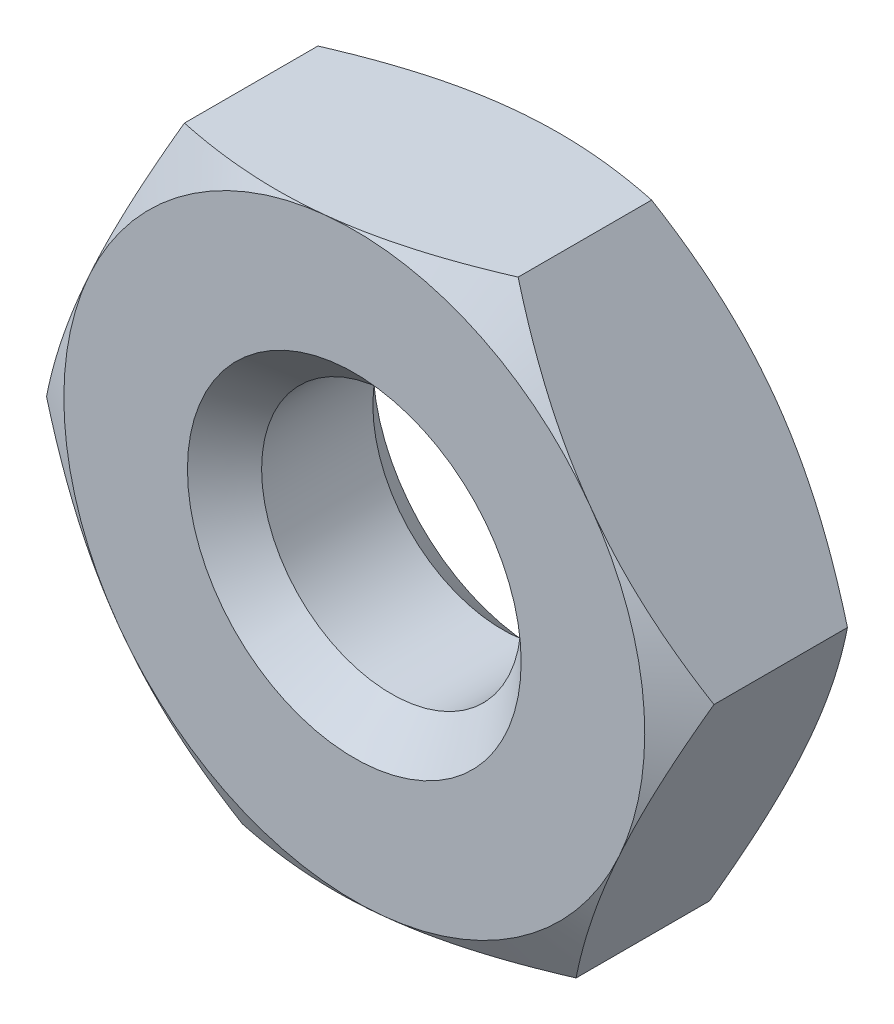
ISO-10303-21;
HEADER;
FILE_DESCRIPTION(('STEP AP214'),'2;1');
FILE_NAME('part.step','',(''),(''),'','','');
FILE_SCHEMA(('AUTOMOTIVE_DESIGN { 1 0 10303 214 1 1 1 1 }'));
ENDSEC;
DATA;
#1=APPLICATION_CONTEXT('core data for automotive mechanical design processes');
#2=APPLICATION_PROTOCOL_DEFINITION('international standard','automotive_design',2000,#1);
#3=PRODUCT_CONTEXT('',#1,'mechanical');
#4=PRODUCT('Part','Part','',(#3));
#5=PRODUCT_RELATED_PRODUCT_CATEGORY('part','',(#4));
#6=PRODUCT_DEFINITION_FORMATION('','',#4);
#7=PRODUCT_DEFINITION_CONTEXT('part definition',#1,'design');
#8=PRODUCT_DEFINITION('design','',#6,#7);
#9=PRODUCT_DEFINITION_SHAPE('','',#8);
#10=(LENGTH_UNIT() NAMED_UNIT(*) SI_UNIT(.MILLI.,.METRE.));
#11=(NAMED_UNIT(*) PLANE_ANGLE_UNIT() SI_UNIT($,.RADIAN.));
#12=(NAMED_UNIT(*) SI_UNIT($,.STERADIAN.) SOLID_ANGLE_UNIT());
#13=UNCERTAINTY_MEASURE_WITH_UNIT(LENGTH_MEASURE(1.E-05),#10,'distance_accuracy_value','');
#14=(GEOMETRIC_REPRESENTATION_CONTEXT(3) GLOBAL_UNCERTAINTY_ASSIGNED_CONTEXT((#13)) GLOBAL_UNIT_ASSIGNED_CONTEXT((#10,
#11,#12)) REPRESENTATION_CONTEXT('',''));
#15=CARTESIAN_POINT('',(0.,0.,0.));
#16=DIRECTION('',(0.,0.,1.));
#17=DIRECTION('',(1.,0.,0.));
#18=AXIS2_PLACEMENT_3D('',#15,#16,#17);
#19=CARTESIAN_POINT('',(0.,0.,1.5));
#20=DIRECTION('',(0.,0.,1.));
#21=DIRECTION('',(1.,0.,0.));
#22=AXIS2_PLACEMENT_3D('',#19,#20,#21);
#23=PLANE('',#22);
#24=CARTESIAN_POINT('',(0.,0.,1.5));
#25=DIRECTION('',(0.,0.,1.));
#26=DIRECTION('',(1.,0.,0.));
#27=AXIS2_PLACEMENT_3D('',#24,#25,#26);
#28=CIRCLE('',#27,1.35);
#29=CARTESIAN_POINT('',(1.35,0.,1.5));
#30=VERTEX_POINT('',#29);
#31=EDGE_CURVE('E11',#30,#30,#28,.F.);
#32=ORIENTED_EDGE('',*,*,#31,.T.);
#33=EDGE_LOOP('',(#32));
#34=FACE_BOUND('',#33,.T.);
#35=CARTESIAN_POINT('',(0.,0.,1.5));
#36=DIRECTION('',(0.,0.,-1.));
#37=DIRECTION('',(-1.,0.,0.));
#38=AXIS2_PLACEMENT_3D('',#35,#36,#37);
#39=CIRCLE('',#38,2.35);
#40=CARTESIAN_POINT('',(2.14226039399558,-0.966033334993097,1.5));
#41=VERTEX_POINT('',#40);
#42=CARTESIAN_POINT('',(0.234520787991168,-2.33826859021798,1.5));
#43=VERTEX_POINT('',#42);
#44=EDGE_CURVE('E306',#41,#43,#39,.T.);
#45=ORIENTED_EDGE('',*,*,#44,.F.);
#46=CARTESIAN_POINT('',(1.90773960600442,1.37223525522489,1.5));
#47=VERTEX_POINT('',#46);
#48=EDGE_CURVE('E308',#47,#41,#39,.T.);
#49=ORIENTED_EDGE('',*,*,#48,.F.);
#50=CARTESIAN_POINT('',(-0.234520787991167,2.33826859021799,1.5));
#51=VERTEX_POINT('',#50);
#52=EDGE_CURVE('E312',#51,#47,#39,.T.);
#53=ORIENTED_EDGE('',*,*,#52,.F.);
#54=CARTESIAN_POINT('',(-2.14226039399558,0.966033334993073,1.5));
#55=VERTEX_POINT('',#54);
#56=EDGE_CURVE('E314',#55,#51,#39,.T.);
#57=ORIENTED_EDGE('',*,*,#56,.F.);
#58=CARTESIAN_POINT('',(-1.90773960600441,-1.37223525522491,1.5));
#59=VERTEX_POINT('',#58);
#60=EDGE_CURVE('E313',#59,#55,#39,.T.);
#61=ORIENTED_EDGE('',*,*,#60,.F.);
#62=EDGE_CURVE('E310',#43,#59,#39,.T.);
#63=ORIENTED_EDGE('',*,*,#62,.F.);
#64=EDGE_LOOP('',(#45,#49,#53,#57,#61,#63));
#65=FACE_BOUND('',#64,.T.);
#66=ADVANCED_FACE('F35',(#34,#65),#23,.T.);
#67=CARTESIAN_POINT('',(0.,0.,0.));
#68=DIRECTION('',(0.,0.,1.));
#69=DIRECTION('',(1.,0.,0.));
#70=AXIS2_PLACEMENT_3D('',#67,#68,#69);
#71=PLANE('',#70);
#72=CARTESIAN_POINT('',(0.,0.,0.));
#73=DIRECTION('',(0.,0.,1.));
#74=DIRECTION('',(1.,0.,0.));
#75=AXIS2_PLACEMENT_3D('',#72,#73,#74);
#76=CIRCLE('',#75,1.35);
#77=CARTESIAN_POINT('',(1.35,0.,0.));
#78=VERTEX_POINT('',#77);
#79=EDGE_CURVE('E291',#78,#78,#76,.T.);
#80=ORIENTED_EDGE('',*,*,#79,.T.);
#81=EDGE_LOOP('',(#80));
#82=FACE_BOUND('',#81,.T.);
#83=CARTESIAN_POINT('',(0.,0.,0.));
#84=DIRECTION('',(0.,0.,-1.));
#85=DIRECTION('',(-1.,0.,0.));
#86=AXIS2_PLACEMENT_3D('',#83,#84,#85);
#87=CIRCLE('',#86,2.35);
#88=CARTESIAN_POINT('',(1.90773960600442,1.37223525522489,0.));
#89=VERTEX_POINT('',#88);
#90=CARTESIAN_POINT('',(2.14226039399558,-0.966033334993096,0.));
#91=VERTEX_POINT('',#90);
#92=EDGE_CURVE('E50',#89,#91,#87,.T.);
#93=ORIENTED_EDGE('',*,*,#92,.T.);
#94=CARTESIAN_POINT('',(0.234520787991168,-2.33826859021798,0.));
#95=VERTEX_POINT('',#94);
#96=EDGE_CURVE('E160',#91,#95,#87,.T.);
#97=ORIENTED_EDGE('',*,*,#96,.T.);
#98=CARTESIAN_POINT('',(-1.90773960600441,-1.37223525522491,0.));
#99=VERTEX_POINT('',#98);
#100=EDGE_CURVE('E159',#95,#99,#87,.T.);
#101=ORIENTED_EDGE('',*,*,#100,.T.);
#102=CARTESIAN_POINT('',(-2.14226039399558,0.966033334993073,0.));
#103=VERTEX_POINT('',#102);
#104=EDGE_CURVE('E139',#99,#103,#87,.T.);
#105=ORIENTED_EDGE('',*,*,#104,.T.);
#106=CARTESIAN_POINT('',(-0.234520787991167,2.33826859021799,0.));
#107=VERTEX_POINT('',#106);
#108=EDGE_CURVE('E125',#103,#107,#87,.T.);
#109=ORIENTED_EDGE('',*,*,#108,.T.);
#110=EDGE_CURVE('E137',#107,#89,#87,.T.);
#111=ORIENTED_EDGE('',*,*,#110,.T.);
#112=EDGE_LOOP('',(#93,#97,#101,#105,#109,#111));
#113=FACE_BOUND('',#112,.T.);
#114=ADVANCED_FACE('F157',(#82,#113),#71,.F.);
#115=CARTESIAN_POINT('',(2.7,0.270801280154528,1.5));
#116=DIRECTION('',(-0.811804087661454,-0.583929895840378,0.));
#117=DIRECTION('',(0.583929895840378,-0.811804087661454,0.));
#118=AXIS2_PLACEMENT_3D('',#115,#116,#117);
#119=PLANE('',#118);
#120=DIRECTION('',(0.,0.,-1.));
#121=VECTOR('',#120,1.);
#122=CARTESIAN_POINT('',(2.7,0.270801280154528,1.5));
#123=LINE('',#122,#121);
#124=CARTESIAN_POINT('',(2.7,0.270801280154528,1.29010646592895));
#125=VERTEX_POINT('',#124);
#126=CARTESIAN_POINT('',(2.7,0.270801280154528,0.209893534071046));
#127=VERTEX_POINT('',#126);
#128=EDGE_CURVE('E246',#125,#127,#123,.T.);
#129=ORIENTED_EDGE('',*,*,#128,.T.);
#130=CARTESIAN_POINT('',(2.70014385980675,0.270601280154528,0.20996465832254));
#131=CARTESIAN_POINT('',(2.63051133952049,0.367407360824881,0.175526082468699));
#132=CARTESIAN_POINT('',(2.56027775767225,0.465049062751183,0.144205107972622));
#133=CARTESIAN_POINT('',(2.41859434859657,0.66202334247343,0.0895332400512122));
#134=CARTESIAN_POINT('',(2.34714200328262,0.761359421019961,0.0662016888914569));
#135=CARTESIAN_POINT('',(2.205122858665,0.958800454520812,0.0298816458536082));
#136=CARTESIAN_POINT('',(2.13457791459205,1.05687502540718,0.0166514432766206));
#137=CARTESIAN_POINT('',(1.9931559770009,1.2534857963907,0.000855453104705458));
#138=CARTESIAN_POINT('',(1.92227949773905,1.35202128154685,-0.00172341294449268));
#139=CARTESIAN_POINT('',(1.7898354382668,1.53615062589446,0.00363278820385261));
#140=CARTESIAN_POINT('',(1.72824806233926,1.62177200593077,0.0102527237013362));
#141=CARTESIAN_POINT('',(1.60547456439622,1.7924569258101,0.0312367478444607));
#142=CARTESIAN_POINT('',(1.54428886723904,1.87751987499705,0.0456080092133851));
#143=CARTESIAN_POINT('',(1.42126209872568,2.04855690235663,0.0815361186884846));
#144=CARTESIAN_POINT('',(1.3594366036038,2.13450932578823,0.103245311238248));
#145=CARTESIAN_POINT('',(1.23670788841934,2.30513198677871,0.152517051116652));
#146=CARTESIAN_POINT('',(1.17580309521484,2.38980441138617,0.18006801633189));
#147=CARTESIAN_POINT('',(1.11533535220208,2.47386923029525,0.20996465832254));
#148=B_SPLINE_CURVE_WITH_KNOTS('',3,(#130,#131,#132,#133,#134,#135,#136,#137,#138,#139,#140,
#141,#142,#143,#144,#145,#146,#147),.UNSPECIFIED.,.F.,.F.,(4,2,2,2,2,2,2,2,4),(0.,
0.372510682786195,0.745916935382948,1.11008089493758,1.47379757539648,1.79053020084112,
2.10755642030711,2.43161612626593,2.75503924877197),.UNSPECIFIED.);
#149=EDGE_CURVE('E363',#127,#89,#148,.T.);
#150=ORIENTED_EDGE('',*,*,#149,.T.);
#151=CARTESIAN_POINT('',(1.11547921200883,2.47366923029525,0.209893534071046));
#152=VERTEX_POINT('',#151);
#153=EDGE_CURVE('E211',#89,#152,#148,.T.);
#154=ORIENTED_EDGE('',*,*,#153,.T.);
#155=DIRECTION('',(0.,0.,-1.));
#156=VECTOR('',#155,1.);
#157=CARTESIAN_POINT('',(1.11547921200883,2.47366923029525,1.5));
#158=LINE('',#157,#156);
#159=CARTESIAN_POINT('',(1.11547921200883,2.47366923029525,1.29010646592895));
#160=VERTEX_POINT('',#159);
#161=EDGE_CURVE('E257',#160,#152,#158,.T.);
#162=ORIENTED_EDGE('',*,*,#161,.F.);
#163=CARTESIAN_POINT('',(1.11533535220208,2.47386923029525,1.29003534167746));
#164=CARTESIAN_POINT('',(1.18496787248834,2.3770631496249,1.3244739175313));
#165=CARTESIAN_POINT('',(1.25520145433658,2.27942144769859,1.35579489202738));
#166=CARTESIAN_POINT('',(1.39688486341226,2.08244716797635,1.41046675994879));
#167=CARTESIAN_POINT('',(1.46833720872621,1.98311108942982,1.43379831110854));
#168=CARTESIAN_POINT('',(1.61035635334383,1.78567005592897,1.47011835414639));
#169=CARTESIAN_POINT('',(1.68090129741678,1.68759548504259,1.48334855672338));
#170=CARTESIAN_POINT('',(1.82232323500794,1.49098471405908,1.49914454689529));
#171=CARTESIAN_POINT('',(1.89319971426978,1.39244922890292,1.50172341294449));
#172=CARTESIAN_POINT('',(2.02564377374203,1.20831988455532,1.49636721179615));
#173=CARTESIAN_POINT('',(2.08723114966957,1.122698504519,1.48974727629866));
#174=CARTESIAN_POINT('',(2.21000464761261,0.952013584639675,1.46876325215554));
#175=CARTESIAN_POINT('',(2.27119034476979,0.866950635452724,1.45439199078661));
#176=CARTESIAN_POINT('',(2.39421711328315,0.695913608093149,1.41846388131152));
#177=CARTESIAN_POINT('',(2.45604260840504,0.609961184661549,1.39675468876175));
#178=CARTESIAN_POINT('',(2.57877132358949,0.439338523671066,1.34748294888335));
#179=CARTESIAN_POINT('',(2.63967611679399,0.354666099063606,1.31993198366811));
#180=CARTESIAN_POINT('',(2.70014385980675,0.270601280154528,1.29003534167746));
#181=B_SPLINE_CURVE_WITH_KNOTS('',3,(#163,#164,#165,#166,#167,#168,#169,#170,#171,#172,#173,
#174,#175,#176,#177,#178,#179,#180),.UNSPECIFIED.,.F.,.F.,(4,2,2,2,2,2,2,2,4),(0.,
0.372510682786195,0.745916935382948,1.11008089493759,1.47379757539648,1.79053020084112,
2.10755642030711,2.43161612626593,2.75503924877197),.UNSPECIFIED.);
#182=EDGE_CURVE('E326',#160,#47,#181,.T.);
#183=ORIENTED_EDGE('',*,*,#182,.T.);
#184=EDGE_CURVE('E321',#47,#125,#181,.T.);
#185=ORIENTED_EDGE('',*,*,#184,.T.);
#186=EDGE_LOOP('',(#129,#150,#154,#162,#183,#185));
#187=FACE_BOUND('',#186,.T.);
#188=ADVANCED_FACE('F220',(#187),#119,.F.);
#189=CARTESIAN_POINT('',(1.11547921200883,2.47366923029525,1.5));
#190=DIRECTION('',(0.0997960799962413,-0.995007910731057,0.));
#191=DIRECTION('',(0.995007910731057,0.0997960799962413,0.));
#192=AXIS2_PLACEMENT_3D('',#189,#190,#191);
#193=PLANE('',#192);
#194=ORIENTED_EDGE('',*,*,#161,.T.);
#195=CARTESIAN_POINT('',(1.11567921200883,2.47368928964933,0.209951561985879));
#196=CARTESIAN_POINT('',(0.997027188534234,2.46178887489013,0.175514061654213));
#197=CARTESIAN_POINT('',(0.877350969931998,2.44978573666734,0.144194229549688));
#198=CARTESIAN_POINT('',(0.635926143934403,2.42557160631874,0.0895247326600419));
#199=CARTESIAN_POINT('',(0.514173246245405,2.41336018389033,0.0661944086496678));
#200=CARTESIAN_POINT('',(0.272176374854789,2.38908867923626,0.0298767915988359));
#201=CARTESIAN_POINT('',(0.151969638787379,2.37703233182506,0.0166477952608066));
#202=CARTESIAN_POINT('',(-0.089009547377638,2.35286289771244,0.000854136536468208));
#203=CARTESIAN_POINT('',(-0.209781121377831,2.34074989888076,-0.00172360331741885));
#204=CARTESIAN_POINT('',(-0.435456212387818,2.3181154160865,0.00363437800069148));
#205=CARTESIAN_POINT('',(-0.540393484503943,2.30759054659577,0.0102545316278817));
#206=CARTESIAN_POINT('',(-0.749584351799733,2.28660937820305,0.0312379656996423));
#207=CARTESIAN_POINT('',(-0.853837223241044,2.27615315188969,0.045608416522159));
#208=CARTESIAN_POINT('',(-1.06345952385288,2.25512871212872,0.0815339955985417));
#209=CARTESIAN_POINT('',(-1.16880241726096,2.24456316013239,0.103241435728903));
#210=CARTESIAN_POINT('',(-1.37791689303299,2.22358965356279,0.152509004875335));
#211=CARTESIAN_POINT('',(-1.48169115518937,2.213181430215,0.180057555087249));
#212=CARTESIAN_POINT('',(-1.58472078799117,2.20284789078664,0.209951561985879));
#213=B_SPLINE_CURVE_WITH_KNOTS('',3,(#195,#196,#197,#198,#199,#200,#201,#202,#203,#204,#205,
#206,#207,#208,#209,#210,#211,#212),.UNSPECIFIED.,.F.,.F.,(4,2,2,2,2,2,2,2,4),(0.,
0.372507576615592,0.745910637979427,1.11007178814973,1.47378569312446,1.79049824467315,
2.10750431453565,2.43154280445515,2.75494486143441),.UNSPECIFIED.);
#214=EDGE_CURVE('E210',#152,#107,#213,.T.);
#215=ORIENTED_EDGE('',*,*,#214,.T.);
#216=CARTESIAN_POINT('',(-1.58452078799117,2.20286795014072,0.209893534071047));
#217=VERTEX_POINT('',#216);
#218=EDGE_CURVE('E131',#107,#217,#213,.T.);
#219=ORIENTED_EDGE('',*,*,#218,.T.);
#220=DIRECTION('',(0.,0.,-1.));
#221=VECTOR('',#220,1.);
#222=CARTESIAN_POINT('',(-1.58452078799117,2.20286795014072,1.5));
#223=LINE('',#222,#221);
#224=CARTESIAN_POINT('',(-1.58452078799117,2.20286795014072,1.29010646592895));
#225=VERTEX_POINT('',#224);
#226=EDGE_CURVE('E155',#225,#217,#223,.T.);
#227=ORIENTED_EDGE('',*,*,#226,.F.);
#228=CARTESIAN_POINT('',(-1.58472078799117,2.20284789078664,1.29004843801412));
#229=CARTESIAN_POINT('',(-1.46606876451657,2.21474830554584,1.32448593834579));
#230=CARTESIAN_POINT('',(-1.34639254591433,2.22675144376863,1.35580577045031));
#231=CARTESIAN_POINT('',(-1.10496771991674,2.25096557411724,1.41047526733996));
#232=CARTESIAN_POINT('',(-0.983214822227741,2.26317699654564,1.43380559135033));
#233=CARTESIAN_POINT('',(-0.741217950837125,2.28744850119971,1.47012320840116));
#234=CARTESIAN_POINT('',(-0.621011214769715,2.29950484861091,1.48335220473919));
#235=CARTESIAN_POINT('',(-0.380032028604698,2.32367428272353,1.49914586346353));
#236=CARTESIAN_POINT('',(-0.259260454604504,2.33578728155521,1.50172360331742));
#237=CARTESIAN_POINT('',(-0.0335853635945177,2.35842176434947,1.49636562199931));
#238=CARTESIAN_POINT('',(0.0713519085216072,2.3689466338402,1.48974546837212));
#239=CARTESIAN_POINT('',(0.280542775817397,2.38992780223292,1.46876203430036));
#240=CARTESIAN_POINT('',(0.384795647258709,2.40038402854628,1.45439158347784));
#241=CARTESIAN_POINT('',(0.594417947870543,2.42140846830725,1.41846600440146));
#242=CARTESIAN_POINT('',(0.699760841278622,2.43197402030358,1.3967585642711));
#243=CARTESIAN_POINT('',(0.908875317050658,2.45294752687318,1.34749099512467));
#244=CARTESIAN_POINT('',(1.01264957920704,2.46335575022097,1.31994244491275));
#245=CARTESIAN_POINT('',(1.11567921200883,2.47368928964933,1.29004843801412));
#246=B_SPLINE_CURVE_WITH_KNOTS('',3,(#228,#229,#230,#231,#232,#233,#234,#235,#236,#237,#238,
#239,#240,#241,#242,#243,#244,#245),.UNSPECIFIED.,.F.,.F.,(4,2,2,2,2,2,2,2,4),(0.,
0.372507576615592,0.745910637979427,1.11007178814973,1.47378569312446,1.79049824467315,
2.10750431453565,2.43154280445515,2.75494486143441),.UNSPECIFIED.);
#247=EDGE_CURVE('E233',#225,#51,#246,.T.);
#248=ORIENTED_EDGE('',*,*,#247,.T.);
#249=EDGE_CURVE('E226',#51,#160,#246,.T.);
#250=ORIENTED_EDGE('',*,*,#249,.T.);
#251=EDGE_LOOP('',(#194,#215,#219,#227,#248,#250));
#252=FACE_BOUND('',#251,.T.);
#253=ADVANCED_FACE('F217',(#252),#193,.F.);
#254=CARTESIAN_POINT('',(-1.58452078799117,2.20286795014072,1.5));
#255=DIRECTION('',(0.911600167657699,-0.411078014890671,0.));
#256=DIRECTION('',(0.411078014890671,0.911600167657699,0.));
#257=AXIS2_PLACEMENT_3D('',#254,#255,#256);
#258=PLANE('',#257);
#259=ORIENTED_EDGE('',*,*,#226,.T.);
#260=CARTESIAN_POINT('',(-1.58443059976403,2.20306795014072,0.209956871628236));
#261=CARTESIAN_POINT('',(-1.63345067760015,2.0943617932671,0.175518935244281));
#262=CARTESIAN_POINT('',(-1.68289389269005,1.98471729384654,0.144198639976346));
#263=CARTESIAN_POINT('',(-1.78263652312812,1.76352959872218,0.0895281817922184));
#264=CARTESIAN_POINT('',(-1.83293771105197,1.65198247218233,0.0661973602552073));
#265=CARTESIAN_POINT('',(-1.93291668378459,1.43027066808709,0.0298787596301643));
#266=CARTESIAN_POINT('',(-1.98257908365834,1.32014010792266,0.0166492742437889));
#267=CARTESIAN_POINT('',(-2.08213761838474,1.09936066056523,0.000854670276066218));
#268=CARTESIAN_POINT('',(-2.13203339125466,0.9887125760995,-0.0017235261728924));
#269=CARTESIAN_POINT('',(-2.22527017743972,0.781952139298309,0.00363373342146763));
#270=CARTESIAN_POINT('',(-2.26862513241851,0.685808870147872,0.0102537986217376));
#271=CARTESIAN_POINT('',(-2.35505257876828,0.494148718719859,0.0312374719392971));
#272=CARTESIAN_POINT('',(-2.39812477109783,0.398632499591864,0.0456082513853444));
#273=CARTESIAN_POINT('',(-2.48473048277911,0.206577029756602,0.0815348563646166));
#274=CARTESIAN_POINT('',(-2.52825303814407,0.110062092614706,0.103243006977525));
#275=CARTESIAN_POINT('',(-2.61464893786071,-0.0815281014937576,0.152512267060848));
#276=CARTESIAN_POINT('',(-2.65752338948007,-0.176605813919788,0.180061796385507));
#277=CARTESIAN_POINT('',(-2.70009018822713,-0.271001280154572,0.209956871628234));
#278=B_SPLINE_CURVE_WITH_KNOTS('',3,(#260,#261,#262,#263,#264,#265,#266,#267,#268,#269,#270,
#271,#272,#273,#274,#275,#276,#277),.UNSPECIFIED.,.F.,.F.,(4,2,2,2,2,2,2,2,4),(0.,
0.372508835949631,0.7459131911343,1.11007548031198,1.47379051055003,1.7905112007199,
2.1075254398965,2.43157253148713,2.75498312911747),.UNSPECIFIED.);
#279=EDGE_CURVE('E129',#217,#103,#278,.T.);
#280=ORIENTED_EDGE('',*,*,#279,.T.);
#281=CARTESIAN_POINT('',(-2.69999999999999,-0.270801280154572,0.209893534071045));
#282=VERTEX_POINT('',#281);
#283=EDGE_CURVE('E142',#103,#282,#278,.T.);
#284=ORIENTED_EDGE('',*,*,#283,.T.);
#285=DIRECTION('',(0.,0.,-1.));
#286=VECTOR('',#285,1.);
#287=CARTESIAN_POINT('',(-2.69999999999999,-0.270801280154572,1.5));
#288=LINE('',#287,#286);
#289=CARTESIAN_POINT('',(-2.69999999999999,-0.270801280154572,1.29010646592896));
#290=VERTEX_POINT('',#289);
#291=EDGE_CURVE('E254',#290,#282,#288,.T.);
#292=ORIENTED_EDGE('',*,*,#291,.F.);
#293=CARTESIAN_POINT('',(-2.70009018822713,-0.271001280154572,1.29004312837177));
#294=CARTESIAN_POINT('',(-2.65107011039101,-0.162295123280948,1.32448106475572));
#295=CARTESIAN_POINT('',(-2.60162689530111,-0.0526506238603917,1.35580136002366));
#296=CARTESIAN_POINT('',(-2.50188426486304,0.168537071263968,1.41047181820778));
#297=CARTESIAN_POINT('',(-2.45158307693919,0.280084197803821,1.43380263974479));
#298=CARTESIAN_POINT('',(-2.35160410420658,0.501796001899056,1.47012124036984));
#299=CARTESIAN_POINT('',(-2.30194170433283,0.611926562063494,1.48335072575621));
#300=CARTESIAN_POINT('',(-2.20238316960642,0.832706009420916,1.49914532972393));
#301=CARTESIAN_POINT('',(-2.1524873967365,0.943354093886649,1.50172352617289));
#302=CARTESIAN_POINT('',(-2.05925061055144,1.15011453068784,1.49636626657853));
#303=CARTESIAN_POINT('',(-2.01589565557265,1.24625779983828,1.48974620137826));
#304=CARTESIAN_POINT('',(-1.92946820922288,1.43791795126629,1.4687625280607));
#305=CARTESIAN_POINT('',(-1.88639601689334,1.53343417039429,1.45439174861466));
#306=CARTESIAN_POINT('',(-1.79979030521205,1.72548964022955,1.41846514363538));
#307=CARTESIAN_POINT('',(-1.75626774984709,1.82200457737144,1.39675699302247));
#308=CARTESIAN_POINT('',(-1.66987185013045,2.01359477147991,1.34748773293915));
#309=CARTESIAN_POINT('',(-1.62699739851109,2.10867248390594,1.31993820361449));
#310=CARTESIAN_POINT('',(-1.58443059976403,2.20306795014072,1.29004312837176));
#311=B_SPLINE_CURVE_WITH_KNOTS('',3,(#293,#294,#295,#296,#297,#298,#299,#300,#301,#302,#303,
#304,#305,#306,#307,#308,#309,#310),.UNSPECIFIED.,.F.,.F.,(4,2,2,2,2,2,2,2,4),(0.,
0.372508835949631,0.745913191134299,1.11007548031198,1.47379051055003,1.79051120071989,
2.1075254398965,2.43157253148713,2.75498312911747),.UNSPECIFIED.);
#312=EDGE_CURVE('E244',#290,#55,#311,.T.);
#313=ORIENTED_EDGE('',*,*,#312,.T.);
#314=EDGE_CURVE('E239',#55,#225,#311,.T.);
#315=ORIENTED_EDGE('',*,*,#314,.T.);
#316=EDGE_LOOP('',(#259,#280,#284,#292,#313,#315));
#317=FACE_BOUND('',#316,.T.);
#318=ADVANCED_FACE('F152',(#317),#258,.F.);
#319=CARTESIAN_POINT('',(-2.69999999999999,-0.270801280154572,1.5));
#320=DIRECTION('',(0.811804087661449,0.583929895840384,0.));
#321=DIRECTION('',(-0.583929895840384,0.811804087661449,0.));
#322=AXIS2_PLACEMENT_3D('',#319,#320,#321);
#323=PLANE('',#322);
#324=ORIENTED_EDGE('',*,*,#291,.T.);
#325=CARTESIAN_POINT('',(-2.70014385980674,-0.270601280154572,0.209964658322539));
#326=CARTESIAN_POINT('',(-2.63051133952048,-0.367407360824924,0.175526082468698));
#327=CARTESIAN_POINT('',(-2.56027775767225,-0.465049062751226,0.144205107972622));
#328=CARTESIAN_POINT('',(-2.41859434859657,-0.662023342473472,0.0895332400512134));
#329=CARTESIAN_POINT('',(-2.34714200328261,-0.761359421020002,0.0662016888914586));
#330=CARTESIAN_POINT('',(-2.20512285866499,-0.958800454520852,0.0298816458536112));
#331=CARTESIAN_POINT('',(-2.13457791459203,-1.05687502540722,0.0166514432766243));
#332=CARTESIAN_POINT('',(-1.99315597700088,-1.25348579639074,0.000855453104710522));
#333=CARTESIAN_POINT('',(-1.92227949773904,-1.35202128154689,-0.00172341294448693));
#334=CARTESIAN_POINT('',(-1.78983543826679,-1.53615062589449,0.00363278820385933));
#335=CARTESIAN_POINT('',(-1.72824806233925,-1.62177200593081,0.010252723701343));
#336=CARTESIAN_POINT('',(-1.60547456439621,-1.79245692581013,0.0312367478444674));
#337=CARTESIAN_POINT('',(-1.54428886723903,-1.87751987499707,0.0456080092133916));
#338=CARTESIAN_POINT('',(-1.42126209872568,-2.04855690235664,0.0815361186884899));
#339=CARTESIAN_POINT('',(-1.35943660360379,-2.13450932578824,0.103245311238253));
#340=CARTESIAN_POINT('',(-1.23670788841933,-2.30513198677872,0.152517051116654));
#341=CARTESIAN_POINT('',(-1.17580309521484,-2.38980441138617,0.180068016331891));
#342=CARTESIAN_POINT('',(-1.11533535220208,-2.47386923029525,0.20996465832254));
#343=B_SPLINE_CURVE_WITH_KNOTS('',3,(#325,#326,#327,#328,#329,#330,#331,#332,#333,#334,#335,
#336,#337,#338,#339,#340,#341,#342),.UNSPECIFIED.,.F.,.F.,(4,2,2,2,2,2,2,2,4),(0.,
0.372510682786195,0.745916935382947,1.11008089493758,1.47379757539648,1.79053020084111,
2.10755642030709,2.4316161262659,2.75503924877193),.UNSPECIFIED.);
#344=EDGE_CURVE('E146',#282,#99,#343,.T.);
#345=ORIENTED_EDGE('',*,*,#344,.T.);
#346=CARTESIAN_POINT('',(-1.11547921200883,-2.47366923029525,0.209893534071046));
#347=VERTEX_POINT('',#346);
#348=EDGE_CURVE('E170',#99,#347,#343,.T.);
#349=ORIENTED_EDGE('',*,*,#348,.T.);
#350=DIRECTION('',(0.,0.,-1.));
#351=VECTOR('',#350,1.);
#352=CARTESIAN_POINT('',(-1.11547921200883,-2.47366923029525,1.5));
#353=LINE('',#352,#351);
#354=CARTESIAN_POINT('',(-1.11547921200883,-2.47366923029525,1.29010646592895));
#355=VERTEX_POINT('',#354);
#356=EDGE_CURVE('E251',#355,#347,#353,.T.);
#357=ORIENTED_EDGE('',*,*,#356,.F.);
#358=CARTESIAN_POINT('',(-1.11533535220208,-2.47386923029525,1.29003534167746));
#359=CARTESIAN_POINT('',(-1.18496787248834,-2.3770631496249,1.3244739175313));
#360=CARTESIAN_POINT('',(-1.25520145433658,-2.27942144769859,1.35579489202738));
#361=CARTESIAN_POINT('',(-1.39688486341226,-2.08244716797635,1.41046675994879));
#362=CARTESIAN_POINT('',(-1.46833720872622,-1.98311108942982,1.43379831110854));
#363=CARTESIAN_POINT('',(-1.61035635334384,-1.78567005592897,1.47011835414639));
#364=CARTESIAN_POINT('',(-1.68090129741679,-1.6875954850426,1.48334855672338));
#365=CARTESIAN_POINT('',(-1.82232323500794,-1.49098471405908,1.49914454689529));
#366=CARTESIAN_POINT('',(-1.89319971426979,-1.39244922890293,1.50172341294449));
#367=CARTESIAN_POINT('',(-2.02564377374204,-1.20831988455533,1.49636721179614));
#368=CARTESIAN_POINT('',(-2.08723114966957,-1.12269850451901,1.48974727629866));
#369=CARTESIAN_POINT('',(-2.21000464761262,-0.952013584639694,1.46876325215553));
#370=CARTESIAN_POINT('',(-2.27119034476979,-0.866950635452746,1.45439199078661));
#371=CARTESIAN_POINT('',(-2.39421711328315,-0.695913608093177,1.41846388131151));
#372=CARTESIAN_POINT('',(-2.45604260840504,-0.60996118466158,1.39675468876175));
#373=CARTESIAN_POINT('',(-2.57877132358949,-0.439338523671104,1.34748294888335));
#374=CARTESIAN_POINT('',(-2.63967611679399,-0.354666099063647,1.31993198366811));
#375=CARTESIAN_POINT('',(-2.70014385980674,-0.270601280154572,1.29003534167746));
#376=B_SPLINE_CURVE_WITH_KNOTS('',3,(#358,#359,#360,#361,#362,#363,#364,#365,#366,#367,#368,
#369,#370,#371,#372,#373,#374,#375),.UNSPECIFIED.,.F.,.F.,(4,2,2,2,2,2,2,2,4),(0.,
0.372510682786195,0.745916935382948,1.11008089493758,1.47379757539648,1.79053020084111,
2.10755642030709,2.4316161262659,2.75503924877193),.UNSPECIFIED.);
#377=EDGE_CURVE('E234',#355,#59,#376,.T.);
#378=ORIENTED_EDGE('',*,*,#377,.T.);
#379=EDGE_CURVE('E245',#59,#290,#376,.T.);
#380=ORIENTED_EDGE('',*,*,#379,.T.);
#381=EDGE_LOOP('',(#324,#345,#349,#357,#378,#380));
#382=FACE_BOUND('',#381,.T.);
#383=ADVANCED_FACE('F365',(#382),#323,.F.);
#384=CARTESIAN_POINT('',(-1.11547921200883,-2.47366923029525,1.5));
#385=DIRECTION('',(-0.0997960799962417,0.995007910731057,0.));
#386=DIRECTION('',(-0.995007910731057,-0.0997960799962417,0.));
#387=AXIS2_PLACEMENT_3D('',#384,#385,#386);
#388=PLANE('',#387);
#389=ORIENTED_EDGE('',*,*,#356,.T.);
#390=CARTESIAN_POINT('',(-1.11567921200883,-2.47368928964933,0.209951561985879));
#391=CARTESIAN_POINT('',(-0.997027188534234,-2.46178887489013,0.175514061654212));
#392=CARTESIAN_POINT('',(-0.877350969931998,-2.44978573666734,0.144194229549688));
#393=CARTESIAN_POINT('',(-0.635926143934403,-2.42557160631873,0.0895247326600412));
#394=CARTESIAN_POINT('',(-0.514173246245405,-2.41336018389033,0.0661944086496671));
#395=CARTESIAN_POINT('',(-0.272176374854789,-2.38908867923626,0.0298767915988353));
#396=CARTESIAN_POINT('',(-0.151969638787379,-2.37703233182506,0.0166477952608062));
#397=CARTESIAN_POINT('',(0.0890095473776378,-2.35286289771244,0.000854136536467768));
#398=CARTESIAN_POINT('',(0.209781121377831,-2.34074989888076,-0.00172360331741949));
#399=CARTESIAN_POINT('',(0.435456212387818,-2.3181154160865,0.00363437800069094));
#400=CARTESIAN_POINT('',(0.540393484503943,-2.30759054659577,0.0102545316278814));
#401=CARTESIAN_POINT('',(0.749584351799733,-2.28660937820305,0.031237965699642));
#402=CARTESIAN_POINT('',(0.853837223241044,-2.27615315188969,0.0456084165221585));
#403=CARTESIAN_POINT('',(1.06345952385288,-2.25512871212872,0.081533995598541));
#404=CARTESIAN_POINT('',(1.16880241726096,-2.24456316013239,0.103241435728903));
#405=CARTESIAN_POINT('',(1.37791689303299,-2.22358965356279,0.152509004875334));
#406=CARTESIAN_POINT('',(1.48169115518937,-2.213181430215,0.180057555087248));
#407=CARTESIAN_POINT('',(1.58472078799117,-2.20284789078664,0.209951561985879));
#408=B_SPLINE_CURVE_WITH_KNOTS('',3,(#390,#391,#392,#393,#394,#395,#396,#397,#398,#399,#400,
#401,#402,#403,#404,#405,#406,#407),.UNSPECIFIED.,.F.,.F.,(4,2,2,2,2,2,2,2,4),(0.,
0.372507576615592,0.745910637979426,1.11007178814973,1.47378569312445,1.79049824467315,
2.10750431453565,2.43154280445515,2.75494486143441),.UNSPECIFIED.);
#409=EDGE_CURVE('E169',#347,#95,#408,.T.);
#410=ORIENTED_EDGE('',*,*,#409,.T.);
#411=CARTESIAN_POINT('',(1.58452078799117,-2.20286795014072,0.209893534071046));
#412=VERTEX_POINT('',#411);
#413=EDGE_CURVE('E136',#95,#412,#408,.T.);
#414=ORIENTED_EDGE('',*,*,#413,.T.);
#415=DIRECTION('',(0.,0.,-1.));
#416=VECTOR('',#415,1.);
#417=CARTESIAN_POINT('',(1.58452078799117,-2.20286795014072,1.5));
#418=LINE('',#417,#416);
#419=CARTESIAN_POINT('',(1.58452078799117,-2.20286795014072,1.29010646592895));
#420=VERTEX_POINT('',#419);
#421=EDGE_CURVE('E249',#420,#412,#418,.T.);
#422=ORIENTED_EDGE('',*,*,#421,.F.);
#423=CARTESIAN_POINT('',(1.58472078799117,-2.20284789078664,1.29004843801412));
#424=CARTESIAN_POINT('',(1.46606876451657,-2.21474830554584,1.32448593834579));
#425=CARTESIAN_POINT('',(1.34639254591433,-2.22675144376863,1.35580577045031));
#426=CARTESIAN_POINT('',(1.10496771991674,-2.25096557411723,1.41047526733996));
#427=CARTESIAN_POINT('',(0.983214822227741,-2.26317699654564,1.43380559135033));
#428=CARTESIAN_POINT('',(0.741217950837125,-2.28744850119971,1.47012320840116));
#429=CARTESIAN_POINT('',(0.621011214769715,-2.29950484861091,1.48335220473919));
#430=CARTESIAN_POINT('',(0.380032028604698,-2.32367428272353,1.49914586346353));
#431=CARTESIAN_POINT('',(0.259260454604505,-2.33578728155521,1.50172360331742));
#432=CARTESIAN_POINT('',(0.0335853635945184,-2.35842176434947,1.49636562199931));
#433=CARTESIAN_POINT('',(-0.0713519085216065,-2.3689466338402,1.48974546837212));
#434=CARTESIAN_POINT('',(-0.280542775817396,-2.38992780223291,1.46876203430036));
#435=CARTESIAN_POINT('',(-0.384795647258708,-2.40038402854628,1.45439158347784));
#436=CARTESIAN_POINT('',(-0.594417947870542,-2.42140846830725,1.41846600440146));
#437=CARTESIAN_POINT('',(-0.699760841278621,-2.43197402030358,1.3967585642711));
#438=CARTESIAN_POINT('',(-0.908875317050657,-2.45294752687318,1.34749099512467));
#439=CARTESIAN_POINT('',(-1.01264957920703,-2.46335575022097,1.31994244491275));
#440=CARTESIAN_POINT('',(-1.11567921200883,-2.47368928964933,1.29004843801412));
#441=B_SPLINE_CURVE_WITH_KNOTS('',3,(#423,#424,#425,#426,#427,#428,#429,#430,#431,#432,#433,
#434,#435,#436,#437,#438,#439,#440),.UNSPECIFIED.,.F.,.F.,(4,2,2,2,2,2,2,2,4),(0.,
0.372507576615592,0.745910637979427,1.11007178814973,1.47378569312446,1.79049824467315,
2.10750431453565,2.43154280445515,2.75494486143441),.UNSPECIFIED.);
#442=EDGE_CURVE('E316',#420,#43,#441,.T.);
#443=ORIENTED_EDGE('',*,*,#442,.T.);
#444=EDGE_CURVE('E322',#43,#355,#441,.T.);
#445=ORIENTED_EDGE('',*,*,#444,.T.);
#446=EDGE_LOOP('',(#389,#410,#414,#422,#443,#445));
#447=FACE_BOUND('',#446,.T.);
#448=ADVANCED_FACE('F175',(#447),#388,.F.);
#449=CARTESIAN_POINT('',(1.58452078799117,-2.20286795014072,1.5));
#450=DIRECTION('',(-0.911600167657695,0.411078014890679,0.));
#451=DIRECTION('',(-0.411078014890679,-0.911600167657696,0.));
#452=AXIS2_PLACEMENT_3D('',#449,#450,#451);
#453=PLANE('',#452);
#454=ORIENTED_EDGE('',*,*,#421,.T.);
#455=CARTESIAN_POINT('',(1.58443059976403,-2.20306795014072,0.209956871628235));
#456=CARTESIAN_POINT('',(1.63345067760016,-2.0943617932671,0.175518935244281));
#457=CARTESIAN_POINT('',(1.68289389269005,-1.98471729384654,0.144198639976347));
#458=CARTESIAN_POINT('',(1.78263652312812,-1.76352959872218,0.0895281817922202));
#459=CARTESIAN_POINT('',(1.83293771105197,-1.65198247218233,0.0661973602552095));
#460=CARTESIAN_POINT('',(1.93291668378459,-1.43027066808709,0.0298787596301678));
#461=CARTESIAN_POINT('',(1.98257908365834,-1.32014010792266,0.0166492742437931));
#462=CARTESIAN_POINT('',(2.08213761838475,-1.09936066056524,0.000854670276071975));
#463=CARTESIAN_POINT('',(2.13203339125468,-0.988712576099503,-0.0017235261728859));
#464=CARTESIAN_POINT('',(2.22527017743973,-0.781952139298315,0.00363373342147546));
#465=CARTESIAN_POINT('',(2.26862513241853,-0.685808870147882,0.0102537986217458));
#466=CARTESIAN_POINT('',(2.35505257876829,-0.494148718719876,0.031237471939305));
#467=CARTESIAN_POINT('',(2.39812477109784,-0.398632499591884,0.0456082513853519));
#468=CARTESIAN_POINT('',(2.48473048277912,-0.206577029756629,0.0815348563646228));
#469=CARTESIAN_POINT('',(2.52825303814408,-0.110062092614737,0.103243006977531));
#470=CARTESIAN_POINT('',(2.61464893786072,0.0815281014937202,0.152512267060851));
#471=CARTESIAN_POINT('',(2.65752338948007,0.176605813919748,0.18006179638551));
#472=CARTESIAN_POINT('',(2.70009018822714,0.271001280154528,0.209956871628235));
#473=B_SPLINE_CURVE_WITH_KNOTS('',3,(#455,#456,#457,#458,#459,#460,#461,#462,#463,#464,#465,
#466,#467,#468,#469,#470,#471,#472),.UNSPECIFIED.,.F.,.F.,(4,2,2,2,2,2,2,2,4),(0.,
0.372508835949631,0.7459131911343,1.11007548031198,1.47379051055003,1.79051120071989,
2.10752543989648,2.4315725314871,2.75498312911743),.UNSPECIFIED.);
#474=EDGE_CURVE('E58',#412,#91,#473,.T.);
#475=ORIENTED_EDGE('',*,*,#474,.T.);
#476=EDGE_CURVE('E191',#91,#127,#473,.T.);
#477=ORIENTED_EDGE('',*,*,#476,.T.);
#478=ORIENTED_EDGE('',*,*,#128,.F.);
#479=CARTESIAN_POINT('',(2.70009018822714,0.271001280154528,1.29004312837177));
#480=CARTESIAN_POINT('',(2.65107011039101,0.162295123280904,1.32448106475572));
#481=CARTESIAN_POINT('',(2.60162689530112,0.0526506238603484,1.35580136002365));
#482=CARTESIAN_POINT('',(2.50188426486304,-0.168537071264011,1.41047181820778));
#483=CARTESIAN_POINT('',(2.4515830769392,-0.280084197803864,1.43380263974479));
#484=CARTESIAN_POINT('',(2.35160410420658,-0.501796001899098,1.47012124036983));
#485=CARTESIAN_POINT('',(2.30194170433282,-0.611926562063536,1.48335072575621));
#486=CARTESIAN_POINT('',(2.20238316960641,-0.832706009420957,1.49914532972393));
#487=CARTESIAN_POINT('',(2.15248739673649,-0.94335409388669,1.50172352617289));
#488=CARTESIAN_POINT('',(2.05925061055144,-1.15011453068788,1.49636626657852));
#489=CARTESIAN_POINT('',(2.01589565557264,-1.24625779983831,1.48974620137825));
#490=CARTESIAN_POINT('',(1.92946820922288,-1.43791795126632,1.4687625280607));
#491=CARTESIAN_POINT('',(1.88639601689333,-1.53343417039431,1.45439174861465));
#492=CARTESIAN_POINT('',(1.79979030521205,-1.72548964022956,1.41846514363538));
#493=CARTESIAN_POINT('',(1.75626774984709,-1.82200457737146,1.39675699302247));
#494=CARTESIAN_POINT('',(1.66987185013045,-2.01359477147991,1.34748773293915));
#495=CARTESIAN_POINT('',(1.62699739851109,-2.10867248390594,1.31993820361449));
#496=CARTESIAN_POINT('',(1.58443059976403,-2.20306795014072,1.29004312837177));
#497=B_SPLINE_CURVE_WITH_KNOTS('',3,(#479,#480,#481,#482,#483,#484,#485,#486,#487,#488,#489,
#490,#491,#492,#493,#494,#495,#496),.UNSPECIFIED.,.F.,.F.,(4,2,2,2,2,2,2,2,4),(0.,
0.372508835949631,0.7459131911343,1.11007548031198,1.47379051055003,1.79051120071989,
2.10752543989649,2.4315725314871,2.75498312911743),.UNSPECIFIED.);
#498=EDGE_CURVE('E264',#125,#41,#497,.T.);
#499=ORIENTED_EDGE('',*,*,#498,.T.);
#500=EDGE_CURVE('E259',#41,#420,#497,.T.);
#501=ORIENTED_EDGE('',*,*,#500,.T.);
#502=EDGE_LOOP('',(#454,#475,#477,#478,#499,#501));
#503=FACE_BOUND('',#502,.T.);
#504=ADVANCED_FACE('F265',(#503),#453,.F.);
#505=CARTESIAN_POINT('',(0.,0.,1.5));
#506=DIRECTION('',(0.,0.,-1.));
#507=DIRECTION('',(-1.,0.,0.));
#508=AXIS2_PLACEMENT_3D('',#505,#506,#507);
#509=CYLINDRICAL_SURFACE('',#508,1.05);
#510=CARTESIAN_POINT('',(0.,0.,0.300000000000001));
#511=DIRECTION('',(0.,0.,1.));
#512=DIRECTION('',(1.,0.,0.));
#513=AXIS2_PLACEMENT_3D('',#510,#511,#512);
#514=CIRCLE('',#513,1.05);
#515=CARTESIAN_POINT('',(1.05,0.,0.300000000000001));
#516=VERTEX_POINT('',#515);
#517=EDGE_CURVE('E43',#516,#516,#514,.F.);
#518=ORIENTED_EDGE('',*,*,#517,.T.);
#519=EDGE_LOOP('',(#518));
#520=FACE_BOUND('',#519,.T.);
#521=CARTESIAN_POINT('',(0.,0.,1.2));
#522=DIRECTION('',(0.,0.,1.));
#523=DIRECTION('',(1.,0.,0.));
#524=AXIS2_PLACEMENT_3D('',#521,#522,#523);
#525=CIRCLE('',#524,1.05);
#526=CARTESIAN_POINT('',(1.05,0.,1.2));
#527=VERTEX_POINT('',#526);
#528=EDGE_CURVE('E289',#527,#527,#525,.T.);
#529=ORIENTED_EDGE('',*,*,#528,.T.);
#530=EDGE_LOOP('',(#529));
#531=FACE_BOUND('',#530,.T.);
#532=ADVANCED_FACE('F269',(#520,#531),#509,.F.);
#533=CARTESIAN_POINT('',(0.,0.,1.5));
#534=DIRECTION('',(0.,0.,-1.));
#535=DIRECTION('',(-1.,0.,0.));
#536=AXIS2_PLACEMENT_3D('',#533,#534,#535);
#537=CONICAL_SURFACE('',#536,2.35,1.0471975511966);
#538=ORIENTED_EDGE('',*,*,#500,.F.);
#539=ORIENTED_EDGE('',*,*,#44,.T.);
#540=ORIENTED_EDGE('',*,*,#442,.F.);
#541=EDGE_LOOP('',(#538,#539,#540));
#542=FACE_BOUND('',#541,.T.);
#543=ADVANCED_FACE('F277',(#542),#537,.T.);
#544=ORIENTED_EDGE('',*,*,#48,.T.);
#545=ORIENTED_EDGE('',*,*,#498,.F.);
#546=ORIENTED_EDGE('',*,*,#184,.F.);
#547=EDGE_LOOP('',(#544,#545,#546));
#548=FACE_BOUND('',#547,.T.);
#549=ADVANCED_FACE('F282',(#548),#537,.T.);
#550=ORIENTED_EDGE('',*,*,#444,.F.);
#551=ORIENTED_EDGE('',*,*,#62,.T.);
#552=ORIENTED_EDGE('',*,*,#377,.F.);
#553=EDGE_LOOP('',(#550,#551,#552));
#554=FACE_BOUND('',#553,.T.);
#555=ADVANCED_FACE('F345',(#554),#537,.T.);
#556=ORIENTED_EDGE('',*,*,#379,.F.);
#557=ORIENTED_EDGE('',*,*,#60,.T.);
#558=ORIENTED_EDGE('',*,*,#312,.F.);
#559=EDGE_LOOP('',(#556,#557,#558));
#560=FACE_BOUND('',#559,.T.);
#561=ADVANCED_FACE('F185',(#560),#537,.T.);
#562=ORIENTED_EDGE('',*,*,#56,.T.);
#563=ORIENTED_EDGE('',*,*,#247,.F.);
#564=ORIENTED_EDGE('',*,*,#314,.F.);
#565=EDGE_LOOP('',(#562,#563,#564));
#566=FACE_BOUND('',#565,.T.);
#567=ADVANCED_FACE('F344',(#566),#537,.T.);
#568=ORIENTED_EDGE('',*,*,#52,.T.);
#569=ORIENTED_EDGE('',*,*,#182,.F.);
#570=ORIENTED_EDGE('',*,*,#249,.F.);
#571=EDGE_LOOP('',(#568,#569,#570));
#572=FACE_BOUND('',#571,.T.);
#573=ADVANCED_FACE('F183',(#572),#537,.T.);
#574=CARTESIAN_POINT('',(0.,0.,0.75));
#575=DIRECTION('',(0.,0.,1.));
#576=DIRECTION('',(1.,0.,0.));
#577=AXIS2_PLACEMENT_3D('',#574,#575,#576);
#578=CONICAL_SURFACE('',#577,3.64903810567667,1.0471975511966);
#579=ORIENTED_EDGE('',*,*,#476,.F.);
#580=ORIENTED_EDGE('',*,*,#92,.F.);
#581=ORIENTED_EDGE('',*,*,#149,.F.);
#582=EDGE_LOOP('',(#579,#580,#581));
#583=FACE_BOUND('',#582,.T.);
#584=ADVANCED_FACE('F178',(#583),#578,.T.);
#585=ORIENTED_EDGE('',*,*,#96,.F.);
#586=ORIENTED_EDGE('',*,*,#474,.F.);
#587=ORIENTED_EDGE('',*,*,#413,.F.);
#588=EDGE_LOOP('',(#585,#586,#587));
#589=FACE_BOUND('',#588,.T.);
#590=ADVANCED_FACE('F182',(#589),#578,.T.);
#591=ORIENTED_EDGE('',*,*,#100,.F.);
#592=ORIENTED_EDGE('',*,*,#409,.F.);
#593=ORIENTED_EDGE('',*,*,#348,.F.);
#594=EDGE_LOOP('',(#591,#592,#593));
#595=FACE_BOUND('',#594,.T.);
#596=ADVANCED_FACE('F368',(#595),#578,.T.);
#597=ORIENTED_EDGE('',*,*,#104,.F.);
#598=ORIENTED_EDGE('',*,*,#344,.F.);
#599=ORIENTED_EDGE('',*,*,#283,.F.);
#600=EDGE_LOOP('',(#597,#598,#599));
#601=FACE_BOUND('',#600,.T.);
#602=ADVANCED_FACE('F143',(#601),#578,.T.);
#603=ORIENTED_EDGE('',*,*,#108,.F.);
#604=ORIENTED_EDGE('',*,*,#279,.F.);
#605=ORIENTED_EDGE('',*,*,#218,.F.);
#606=EDGE_LOOP('',(#603,#604,#605));
#607=FACE_BOUND('',#606,.T.);
#608=ADVANCED_FACE('F127',(#607),#578,.T.);
#609=ORIENTED_EDGE('',*,*,#110,.F.);
#610=ORIENTED_EDGE('',*,*,#214,.F.);
#611=ORIENTED_EDGE('',*,*,#153,.F.);
#612=EDGE_LOOP('',(#609,#610,#611));
#613=FACE_BOUND('',#612,.T.);
#614=ADVANCED_FACE('F184',(#613),#578,.T.);
#615=CARTESIAN_POINT('',(0.,0.,0.));
#616=DIRECTION('',(0.,0.,-1.));
#617=DIRECTION('',(-1.,0.,0.));
#618=AXIS2_PLACEMENT_3D('',#615,#616,#617);
#619=CONICAL_SURFACE('',#618,1.35,0.785398163397447);
#620=ORIENTED_EDGE('',*,*,#517,.F.);
#621=EDGE_LOOP('',(#620));
#622=FACE_BOUND('',#621,.T.);
#623=ORIENTED_EDGE('',*,*,#79,.F.);
#624=EDGE_LOOP('',(#623));
#625=FACE_BOUND('',#624,.T.);
#626=ADVANCED_FACE('F472',(#622,#625),#619,.F.);
#627=CARTESIAN_POINT('',(0.,0.,1.2));
#628=DIRECTION('',(0.,0.,1.));
#629=DIRECTION('',(1.,0.,0.));
#630=AXIS2_PLACEMENT_3D('',#627,#628,#629);
#631=CONICAL_SURFACE('',#630,1.05,0.78539816339745);
#632=ORIENTED_EDGE('',*,*,#31,.F.);
#633=EDGE_LOOP('',(#632));
#634=FACE_BOUND('',#633,.T.);
#635=ORIENTED_EDGE('',*,*,#528,.F.);
#636=EDGE_LOOP('',(#635));
#637=FACE_BOUND('',#636,.T.);
#638=ADVANCED_FACE('F37',(#634,#637),#631,.F.);
#639=CLOSED_SHELL('',(#66,#114,#188,#253,#318,#383,#448,#504,#532,#543,#549,#555,#561,#567,#573,
#584,#590,#596,#602,#608,#614,#626,#638));
#640=MANIFOLD_SOLID_BREP('B2',#639);
#641=ADVANCED_BREP_SHAPE_REPRESENTATION('',(#18,#640),#14);
#642=SHAPE_DEFINITION_REPRESENTATION(#9,#641);
ENDSEC;
END-ISO-10303-21;
